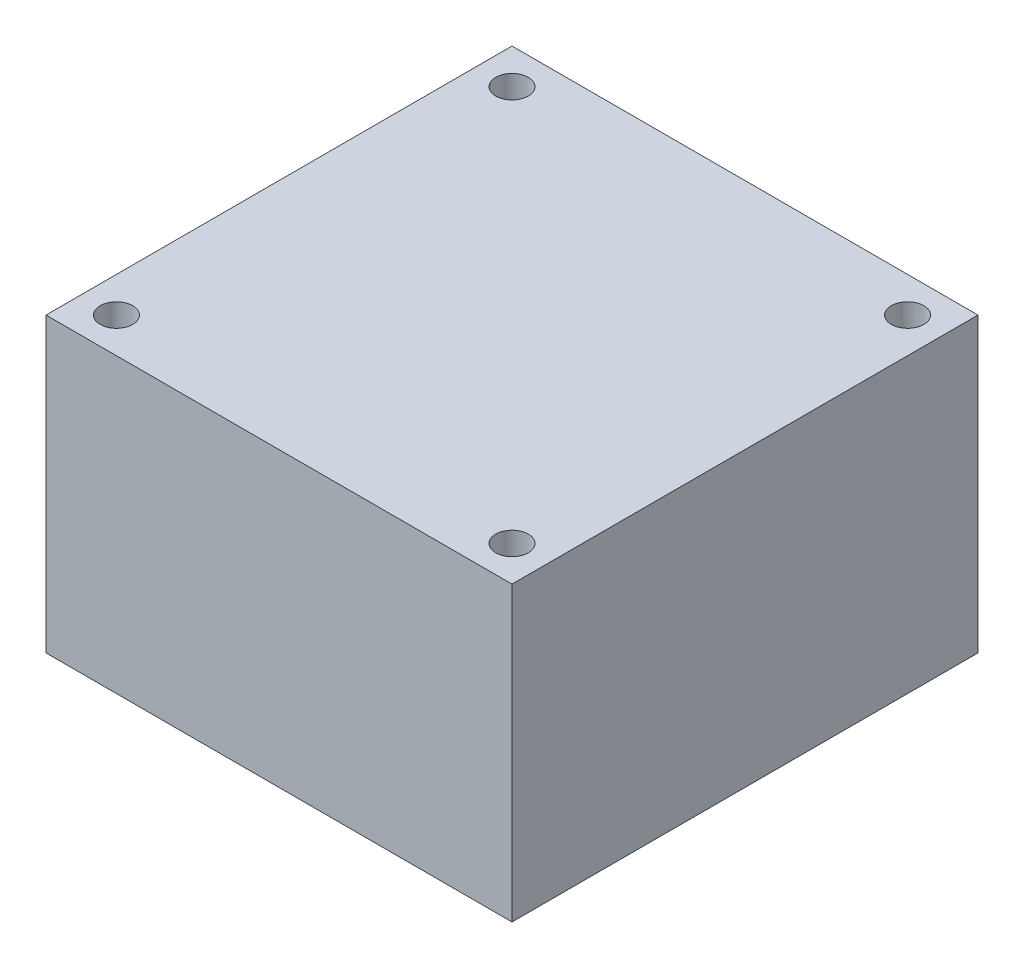
ISO-10303-21;
HEADER;
FILE_DESCRIPTION(('STEP AP214'),'2;1');
FILE_NAME('part.step','',(''),(''),'','','');
FILE_SCHEMA(('AUTOMOTIVE_DESIGN { 1 0 10303 214 1 1 1 1 }'));
ENDSEC;
DATA;
#1=APPLICATION_CONTEXT('core data for automotive mechanical design processes');
#2=APPLICATION_PROTOCOL_DEFINITION('international standard','automotive_design',2000,#1);
#3=PRODUCT_CONTEXT('',#1,'mechanical');
#4=PRODUCT('Part','Part','',(#3));
#5=PRODUCT_RELATED_PRODUCT_CATEGORY('part','',(#4));
#6=PRODUCT_DEFINITION_FORMATION('','',#4);
#7=PRODUCT_DEFINITION_CONTEXT('part definition',#1,'design');
#8=PRODUCT_DEFINITION('design','',#6,#7);
#9=PRODUCT_DEFINITION_SHAPE('','',#8);
#10=(LENGTH_UNIT() NAMED_UNIT(*) SI_UNIT(.MILLI.,.METRE.));
#11=(NAMED_UNIT(*) PLANE_ANGLE_UNIT() SI_UNIT($,.RADIAN.));
#12=(NAMED_UNIT(*) SI_UNIT($,.STERADIAN.) SOLID_ANGLE_UNIT());
#13=UNCERTAINTY_MEASURE_WITH_UNIT(LENGTH_MEASURE(1.E-05),#10,'distance_accuracy_value','');
#14=(GEOMETRIC_REPRESENTATION_CONTEXT(3) GLOBAL_UNCERTAINTY_ASSIGNED_CONTEXT((#13)) GLOBAL_UNIT_ASSIGNED_CONTEXT((#10,
#11,#12)) REPRESENTATION_CONTEXT('',''));
#15=CARTESIAN_POINT('',(0.,0.,0.));
#16=DIRECTION('',(0.,0.,1.));
#17=DIRECTION('',(1.,0.,0.));
#18=AXIS2_PLACEMENT_3D('',#15,#16,#17);
#19=CARTESIAN_POINT('',(0.,27.,0.));
#20=DIRECTION('',(0.,1.,0.));
#21=DIRECTION('',(0.,0.,1.));
#22=AXIS2_PLACEMENT_3D('',#19,#20,#21);
#23=PLANE('',#22);
#24=CARTESIAN_POINT('',(-18.25,27.,18.25));
#25=DIRECTION('',(0.,1.,0.));
#26=DIRECTION('',(0.,0.,1.));
#27=AXIS2_PLACEMENT_3D('',#24,#25,#26);
#28=CIRCLE('',#27,1.5);
#29=CARTESIAN_POINT('',(-18.25,27.,19.75));
#30=VERTEX_POINT('',#29);
#31=EDGE_CURVE('E123',#30,#30,#28,.T.);
#32=ORIENTED_EDGE('',*,*,#31,.F.);
#33=EDGE_LOOP('',(#32));
#34=FACE_BOUND('',#33,.T.);
#35=CARTESIAN_POINT('',(-18.25,27.,-18.25));
#36=DIRECTION('',(0.,1.,0.));
#37=DIRECTION('',(0.,0.,1.));
#38=AXIS2_PLACEMENT_3D('',#35,#36,#37);
#39=CIRCLE('',#38,1.5);
#40=CARTESIAN_POINT('',(-18.25,27.,-16.75));
#41=VERTEX_POINT('',#40);
#42=EDGE_CURVE('E102',#41,#41,#39,.T.);
#43=ORIENTED_EDGE('',*,*,#42,.F.);
#44=EDGE_LOOP('',(#43));
#45=FACE_BOUND('',#44,.T.);
#46=DIRECTION('',(0.,0.,-1.));
#47=VECTOR('',#46,1.);
#48=CARTESIAN_POINT('',(21.5,27.,-21.5));
#49=LINE('',#48,#47);
#50=CARTESIAN_POINT('',(21.5,27.,21.5));
#51=VERTEX_POINT('',#50);
#52=CARTESIAN_POINT('',(21.5,27.,-21.5));
#53=VERTEX_POINT('',#52);
#54=EDGE_CURVE('E87',#51,#53,#49,.T.);
#55=ORIENTED_EDGE('',*,*,#54,.T.);
#56=DIRECTION('',(-1.,0.,0.));
#57=VECTOR('',#56,1.);
#58=CARTESIAN_POINT('',(-21.5,27.,-21.5));
#59=LINE('',#58,#57);
#60=CARTESIAN_POINT('',(-21.5,27.,-21.5));
#61=VERTEX_POINT('',#60);
#62=EDGE_CURVE('E82',#53,#61,#59,.T.);
#63=ORIENTED_EDGE('',*,*,#62,.T.);
#64=DIRECTION('',(0.,0.,1.));
#65=VECTOR('',#64,1.);
#66=CARTESIAN_POINT('',(-21.5,27.,-21.5));
#67=LINE('',#66,#65);
#68=CARTESIAN_POINT('',(-21.5,27.,21.5));
#69=VERTEX_POINT('',#68);
#70=EDGE_CURVE('E85',#61,#69,#67,.T.);
#71=ORIENTED_EDGE('',*,*,#70,.T.);
#72=DIRECTION('',(1.,0.,0.));
#73=VECTOR('',#72,1.);
#74=CARTESIAN_POINT('',(-21.5,27.,21.5));
#75=LINE('',#74,#73);
#76=EDGE_CURVE('E52',#69,#51,#75,.T.);
#77=ORIENTED_EDGE('',*,*,#76,.T.);
#78=EDGE_LOOP('',(#55,#63,#71,#77));
#79=FACE_BOUND('',#78,.T.);
#80=CARTESIAN_POINT('',(18.25,27.,-18.25));
#81=DIRECTION('',(0.,1.,0.));
#82=DIRECTION('',(0.,0.,1.));
#83=AXIS2_PLACEMENT_3D('',#80,#81,#82);
#84=CIRCLE('',#83,1.5);
#85=CARTESIAN_POINT('',(18.25,27.,-16.75));
#86=VERTEX_POINT('',#85);
#87=EDGE_CURVE('E117',#86,#86,#84,.T.);
#88=ORIENTED_EDGE('',*,*,#87,.F.);
#89=EDGE_LOOP('',(#88));
#90=FACE_BOUND('',#89,.T.);
#91=CARTESIAN_POINT('',(18.25,27.,18.25));
#92=DIRECTION('',(0.,1.,0.));
#93=DIRECTION('',(0.,0.,1.));
#94=AXIS2_PLACEMENT_3D('',#91,#92,#93);
#95=CIRCLE('',#94,1.5);
#96=CARTESIAN_POINT('',(18.25,27.,19.75));
#97=VERTEX_POINT('',#96);
#98=EDGE_CURVE('E129',#97,#97,#95,.T.);
#99=ORIENTED_EDGE('',*,*,#98,.F.);
#100=EDGE_LOOP('',(#99));
#101=FACE_BOUND('',#100,.T.);
#102=ADVANCED_FACE('F35',(#34,#45,#79,#90,#101),#23,.T.);
#103=CARTESIAN_POINT('',(0.,0.,0.));
#104=DIRECTION('',(0.,1.,0.));
#105=DIRECTION('',(0.,0.,1.));
#106=AXIS2_PLACEMENT_3D('',#103,#104,#105);
#107=PLANE('',#106);
#108=DIRECTION('',(0.,0.,-1.));
#109=VECTOR('',#108,1.);
#110=CARTESIAN_POINT('',(21.5,0.,-21.5));
#111=LINE('',#110,#109);
#112=CARTESIAN_POINT('',(21.5,0.,21.5));
#113=VERTEX_POINT('',#112);
#114=CARTESIAN_POINT('',(21.5,0.,-21.5));
#115=VERTEX_POINT('',#114);
#116=EDGE_CURVE('E99',#113,#115,#111,.T.);
#117=ORIENTED_EDGE('',*,*,#116,.F.);
#118=DIRECTION('',(1.,0.,0.));
#119=VECTOR('',#118,1.);
#120=CARTESIAN_POINT('',(-21.5,0.,21.5));
#121=LINE('',#120,#119);
#122=CARTESIAN_POINT('',(-21.5,0.,21.5));
#123=VERTEX_POINT('',#122);
#124=EDGE_CURVE('E75',#123,#113,#121,.T.);
#125=ORIENTED_EDGE('',*,*,#124,.F.);
#126=DIRECTION('',(0.,0.,1.));
#127=VECTOR('',#126,1.);
#128=CARTESIAN_POINT('',(-21.5,0.,-21.5));
#129=LINE('',#128,#127);
#130=CARTESIAN_POINT('',(-21.5,0.,-21.5));
#131=VERTEX_POINT('',#130);
#132=EDGE_CURVE('E69',#131,#123,#129,.T.);
#133=ORIENTED_EDGE('',*,*,#132,.F.);
#134=DIRECTION('',(-1.,0.,0.));
#135=VECTOR('',#134,1.);
#136=CARTESIAN_POINT('',(-21.5,0.,-21.5));
#137=LINE('',#136,#135);
#138=EDGE_CURVE('E91',#115,#131,#137,.T.);
#139=ORIENTED_EDGE('',*,*,#138,.F.);
#140=EDGE_LOOP('',(#117,#125,#133,#139));
#141=FACE_BOUND('',#140,.T.);
#142=CARTESIAN_POINT('',(-18.25,0.,-18.25));
#143=DIRECTION('',(0.,1.,0.));
#144=DIRECTION('',(0.,0.,1.));
#145=AXIS2_PLACEMENT_3D('',#142,#143,#144);
#146=CIRCLE('',#145,1.5);
#147=CARTESIAN_POINT('',(-18.25,0.,-16.75));
#148=VERTEX_POINT('',#147);
#149=EDGE_CURVE('E114',#148,#148,#146,.T.);
#150=ORIENTED_EDGE('',*,*,#149,.T.);
#151=EDGE_LOOP('',(#150));
#152=FACE_BOUND('',#151,.T.);
#153=CARTESIAN_POINT('',(18.25,0.,-18.25));
#154=DIRECTION('',(0.,1.,0.));
#155=DIRECTION('',(0.,0.,1.));
#156=AXIS2_PLACEMENT_3D('',#153,#154,#155);
#157=CIRCLE('',#156,1.5);
#158=CARTESIAN_POINT('',(18.25,0.,-16.75));
#159=VERTEX_POINT('',#158);
#160=EDGE_CURVE('E120',#159,#159,#157,.T.);
#161=ORIENTED_EDGE('',*,*,#160,.T.);
#162=EDGE_LOOP('',(#161));
#163=FACE_BOUND('',#162,.T.);
#164=CARTESIAN_POINT('',(-18.25,0.,18.25));
#165=DIRECTION('',(0.,1.,0.));
#166=DIRECTION('',(0.,0.,1.));
#167=AXIS2_PLACEMENT_3D('',#164,#165,#166);
#168=CIRCLE('',#167,1.5);
#169=CARTESIAN_POINT('',(-18.25,0.,19.75));
#170=VERTEX_POINT('',#169);
#171=EDGE_CURVE('E126',#170,#170,#168,.T.);
#172=ORIENTED_EDGE('',*,*,#171,.T.);
#173=EDGE_LOOP('',(#172));
#174=FACE_BOUND('',#173,.T.);
#175=CARTESIAN_POINT('',(18.25,0.,18.25));
#176=DIRECTION('',(0.,1.,0.));
#177=DIRECTION('',(0.,0.,1.));
#178=AXIS2_PLACEMENT_3D('',#175,#176,#177);
#179=CIRCLE('',#178,1.5);
#180=CARTESIAN_POINT('',(18.25,0.,19.75));
#181=VERTEX_POINT('',#180);
#182=EDGE_CURVE('E132',#181,#181,#179,.T.);
#183=ORIENTED_EDGE('',*,*,#182,.T.);
#184=EDGE_LOOP('',(#183));
#185=FACE_BOUND('',#184,.T.);
#186=ADVANCED_FACE('F110',(#141,#152,#163,#174,#185),#107,.F.);
#187=CARTESIAN_POINT('',(21.5,27.,-21.5));
#188=DIRECTION('',(-1.,0.,0.));
#189=DIRECTION('',(0.,0.,1.));
#190=AXIS2_PLACEMENT_3D('',#187,#188,#189);
#191=PLANE('',#190);
#192=ORIENTED_EDGE('',*,*,#116,.T.);
#193=DIRECTION('',(0.,-1.,0.));
#194=VECTOR('',#193,1.);
#195=CARTESIAN_POINT('',(21.5,27.,-21.5));
#196=LINE('',#195,#194);
#197=EDGE_CURVE('E11',#53,#115,#196,.T.);
#198=ORIENTED_EDGE('',*,*,#197,.F.);
#199=ORIENTED_EDGE('',*,*,#54,.F.);
#200=DIRECTION('',(0.,-1.,0.));
#201=VECTOR('',#200,1.);
#202=CARTESIAN_POINT('',(21.5,27.,21.5));
#203=LINE('',#202,#201);
#204=EDGE_CURVE('E95',#51,#113,#203,.T.);
#205=ORIENTED_EDGE('',*,*,#204,.T.);
#206=EDGE_LOOP('',(#192,#198,#199,#205));
#207=FACE_BOUND('',#206,.T.);
#208=ADVANCED_FACE('F37',(#207),#191,.F.);
#209=CARTESIAN_POINT('',(-21.5,27.,-21.5));
#210=DIRECTION('',(0.,0.,1.));
#211=DIRECTION('',(1.,0.,0.));
#212=AXIS2_PLACEMENT_3D('',#209,#210,#211);
#213=PLANE('',#212);
#214=ORIENTED_EDGE('',*,*,#138,.T.);
#215=DIRECTION('',(0.,-1.,0.));
#216=VECTOR('',#215,1.);
#217=CARTESIAN_POINT('',(-21.5,27.,-21.5));
#218=LINE('',#217,#216);
#219=EDGE_CURVE('E44',#61,#131,#218,.T.);
#220=ORIENTED_EDGE('',*,*,#219,.F.);
#221=ORIENTED_EDGE('',*,*,#62,.F.);
#222=ORIENTED_EDGE('',*,*,#197,.T.);
#223=EDGE_LOOP('',(#214,#220,#221,#222));
#224=FACE_BOUND('',#223,.T.);
#225=ADVANCED_FACE('F90',(#224),#213,.F.);
#226=CARTESIAN_POINT('',(-21.5,27.,-21.5));
#227=DIRECTION('',(1.,0.,0.));
#228=DIRECTION('',(0.,0.,-1.));
#229=AXIS2_PLACEMENT_3D('',#226,#227,#228);
#230=PLANE('',#229);
#231=ORIENTED_EDGE('',*,*,#132,.T.);
#232=DIRECTION('',(0.,-1.,0.));
#233=VECTOR('',#232,1.);
#234=CARTESIAN_POINT('',(-21.5,27.,21.5));
#235=LINE('',#234,#233);
#236=EDGE_CURVE('E92',#69,#123,#235,.T.);
#237=ORIENTED_EDGE('',*,*,#236,.F.);
#238=ORIENTED_EDGE('',*,*,#70,.F.);
#239=ORIENTED_EDGE('',*,*,#219,.T.);
#240=EDGE_LOOP('',(#231,#237,#238,#239));
#241=FACE_BOUND('',#240,.T.);
#242=ADVANCED_FACE('F93',(#241),#230,.F.);
#243=CARTESIAN_POINT('',(-21.5,27.,21.5));
#244=DIRECTION('',(0.,0.,-1.));
#245=DIRECTION('',(-1.,0.,0.));
#246=AXIS2_PLACEMENT_3D('',#243,#244,#245);
#247=PLANE('',#246);
#248=ORIENTED_EDGE('',*,*,#124,.T.);
#249=ORIENTED_EDGE('',*,*,#204,.F.);
#250=ORIENTED_EDGE('',*,*,#76,.F.);
#251=ORIENTED_EDGE('',*,*,#236,.T.);
#252=EDGE_LOOP('',(#248,#249,#250,#251));
#253=FACE_BOUND('',#252,.T.);
#254=ADVANCED_FACE('F107',(#253),#247,.F.);
#255=CARTESIAN_POINT('',(-18.25,27.,-18.25));
#256=DIRECTION('',(0.,-1.,0.));
#257=DIRECTION('',(0.,0.,-1.));
#258=AXIS2_PLACEMENT_3D('',#255,#256,#257);
#259=CYLINDRICAL_SURFACE('',#258,1.5);
#260=ORIENTED_EDGE('',*,*,#42,.T.);
#261=EDGE_LOOP('',(#260));
#262=FACE_BOUND('',#261,.T.);
#263=ORIENTED_EDGE('',*,*,#149,.F.);
#264=EDGE_LOOP('',(#263));
#265=FACE_BOUND('',#264,.T.);
#266=ADVANCED_FACE('F151',(#262,#265),#259,.F.);
#267=CARTESIAN_POINT('',(18.25,27.,-18.25));
#268=DIRECTION('',(0.,-1.,0.));
#269=DIRECTION('',(0.,0.,-1.));
#270=AXIS2_PLACEMENT_3D('',#267,#268,#269);
#271=CYLINDRICAL_SURFACE('',#270,1.5);
#272=ORIENTED_EDGE('',*,*,#87,.T.);
#273=EDGE_LOOP('',(#272));
#274=FACE_BOUND('',#273,.T.);
#275=ORIENTED_EDGE('',*,*,#160,.F.);
#276=EDGE_LOOP('',(#275));
#277=FACE_BOUND('',#276,.T.);
#278=ADVANCED_FACE('F197',(#274,#277),#271,.F.);
#279=CARTESIAN_POINT('',(-18.25,27.,18.25));
#280=DIRECTION('',(0.,-1.,0.));
#281=DIRECTION('',(0.,0.,-1.));
#282=AXIS2_PLACEMENT_3D('',#279,#280,#281);
#283=CYLINDRICAL_SURFACE('',#282,1.5);
#284=ORIENTED_EDGE('',*,*,#31,.T.);
#285=EDGE_LOOP('',(#284));
#286=FACE_BOUND('',#285,.T.);
#287=ORIENTED_EDGE('',*,*,#171,.F.);
#288=EDGE_LOOP('',(#287));
#289=FACE_BOUND('',#288,.T.);
#290=ADVANCED_FACE('F205',(#286,#289),#283,.F.);
#291=CARTESIAN_POINT('',(18.25,27.,18.25));
#292=DIRECTION('',(0.,-1.,0.));
#293=DIRECTION('',(0.,0.,-1.));
#294=AXIS2_PLACEMENT_3D('',#291,#292,#293);
#295=CYLINDRICAL_SURFACE('',#294,1.5);
#296=ORIENTED_EDGE('',*,*,#98,.T.);
#297=EDGE_LOOP('',(#296));
#298=FACE_BOUND('',#297,.T.);
#299=ORIENTED_EDGE('',*,*,#182,.F.);
#300=EDGE_LOOP('',(#299));
#301=FACE_BOUND('',#300,.T.);
#302=ADVANCED_FACE('F138',(#298,#301),#295,.F.);
#303=CLOSED_SHELL('',(#102,#186,#208,#225,#242,#254,#266,#278,#290,#302));
#304=MANIFOLD_SOLID_BREP('B2',#303);
#305=ADVANCED_BREP_SHAPE_REPRESENTATION('',(#18,#304),#14);
#306=SHAPE_DEFINITION_REPRESENTATION(#9,#305);
ENDSEC;
END-ISO-10303-21;
